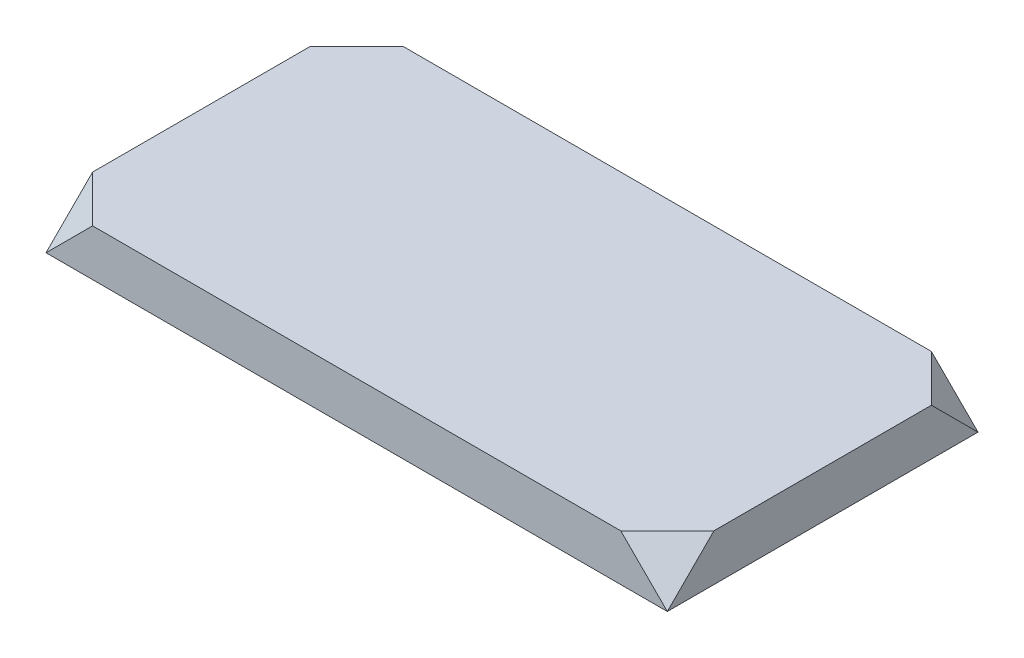
ISO-10303-21;
HEADER;
FILE_DESCRIPTION(('STEP AP214'),'2;1');
FILE_NAME('part.step','',(''),(''),'','','');
FILE_SCHEMA(('AUTOMOTIVE_DESIGN { 1 0 10303 214 1 1 1 1 }'));
ENDSEC;
DATA;
#1=APPLICATION_CONTEXT('core data for automotive mechanical design processes');
#2=APPLICATION_PROTOCOL_DEFINITION('international standard','automotive_design',2000,#1);
#3=PRODUCT_CONTEXT('',#1,'mechanical');
#4=PRODUCT('Part','Part','',(#3));
#5=PRODUCT_RELATED_PRODUCT_CATEGORY('part','',(#4));
#6=PRODUCT_DEFINITION_FORMATION('','',#4);
#7=PRODUCT_DEFINITION_CONTEXT('part definition',#1,'design');
#8=PRODUCT_DEFINITION('design','',#6,#7);
#9=PRODUCT_DEFINITION_SHAPE('','',#8);
#10=(LENGTH_UNIT() NAMED_UNIT(*) SI_UNIT(.MILLI.,.METRE.));
#11=(NAMED_UNIT(*) PLANE_ANGLE_UNIT() SI_UNIT($,.RADIAN.));
#12=(NAMED_UNIT(*) SI_UNIT($,.STERADIAN.) SOLID_ANGLE_UNIT());
#13=UNCERTAINTY_MEASURE_WITH_UNIT(LENGTH_MEASURE(1.E-05),#10,'distance_accuracy_value','');
#14=(GEOMETRIC_REPRESENTATION_CONTEXT(3) GLOBAL_UNCERTAINTY_ASSIGNED_CONTEXT((#13)) GLOBAL_UNIT_ASSIGNED_CONTEXT((#10,
#11,#12)) REPRESENTATION_CONTEXT('',''));
#15=CARTESIAN_POINT('',(0.,0.,0.));
#16=DIRECTION('',(0.,0.,1.));
#17=DIRECTION('',(1.,0.,0.));
#18=AXIS2_PLACEMENT_3D('',#15,#16,#17);
#19=CARTESIAN_POINT('',(20.,3.,10.));
#20=DIRECTION('',(-1.,0.,0.));
#21=DIRECTION('',(0.,0.,1.));
#22=AXIS2_PLACEMENT_3D('',#19,#20,#21);
#23=PLANE('',#22);
#24=DIRECTION('',(0.,0.707106781186548,-0.707106781186547));
#25=VECTOR('',#24,1.);
#26=CARTESIAN_POINT('',(20.,1.5,8.50000000000001));
#27=LINE('',#26,#25);
#28=CARTESIAN_POINT('',(20.,0.,10.));
#29=VERTEX_POINT('',#28);
#30=CARTESIAN_POINT('',(20.,3.,7.00000000000001));
#31=VERTEX_POINT('',#30);
#32=EDGE_CURVE('E111',#29,#31,#27,.T.);
#33=ORIENTED_EDGE('',*,*,#32,.F.);
#34=DIRECTION('',(0.,0.,-1.));
#35=VECTOR('',#34,1.);
#36=CARTESIAN_POINT('',(20.,0.,10.));
#37=LINE('',#36,#35);
#38=CARTESIAN_POINT('',(20.,0.,-10.));
#39=VERTEX_POINT('',#38);
#40=EDGE_CURVE('E159',#29,#39,#37,.T.);
#41=ORIENTED_EDGE('',*,*,#40,.T.);
#42=DIRECTION('',(0.,-0.707106781186548,-0.707106781186547));
#43=VECTOR('',#42,1.);
#44=CARTESIAN_POINT('',(20.,11.5,1.50000000000001));
#45=LINE('',#44,#43);
#46=CARTESIAN_POINT('',(20.,3.,-6.99999999999999));
#47=VERTEX_POINT('',#46);
#48=EDGE_CURVE('E124',#47,#39,#45,.T.);
#49=ORIENTED_EDGE('',*,*,#48,.F.);
#50=DIRECTION('',(0.,0.,-1.));
#51=VECTOR('',#50,1.);
#52=CARTESIAN_POINT('',(20.,3.,10.));
#53=LINE('',#52,#51);
#54=EDGE_CURVE('E150',#31,#47,#53,.T.);
#55=ORIENTED_EDGE('',*,*,#54,.F.);
#56=EDGE_LOOP('',(#33,#41,#49,#55));
#57=FACE_BOUND('',#56,.T.);
#58=ADVANCED_FACE('F43',(#57),#23,.F.);
#59=CARTESIAN_POINT('',(-20.,3.,-9.99999999999999));
#60=DIRECTION('',(0.,0.,1.));
#61=DIRECTION('',(1.,0.,0.));
#62=AXIS2_PLACEMENT_3D('',#59,#60,#61);
#63=PLANE('',#62);
#64=DIRECTION('',(-0.707106781186547,0.707106781186548,0.));
#65=VECTOR('',#64,1.);
#66=CARTESIAN_POINT('',(-1.49999999999996,21.5,-10.));
#67=LINE('',#66,#65);
#68=CARTESIAN_POINT('',(17.,3.,-10.));
#69=VERTEX_POINT('',#68);
#70=EDGE_CURVE('E118',#39,#69,#67,.T.);
#71=ORIENTED_EDGE('',*,*,#70,.F.);
#72=DIRECTION('',(-1.,0.,0.));
#73=VECTOR('',#72,1.);
#74=CARTESIAN_POINT('',(-20.,0.,-9.99999999999999));
#75=LINE('',#74,#73);
#76=CARTESIAN_POINT('',(-20.,0.,-9.99999999999999));
#77=VERTEX_POINT('',#76);
#78=EDGE_CURVE('E155',#39,#77,#75,.T.);
#79=ORIENTED_EDGE('',*,*,#78,.T.);
#80=DIRECTION('',(-0.707106781186547,-0.707106781186548,0.));
#81=VECTOR('',#80,1.);
#82=CARTESIAN_POINT('',(-18.5,1.5,-9.99999999999999));
#83=LINE('',#82,#81);
#84=CARTESIAN_POINT('',(-17.,3.,-10.));
#85=VERTEX_POINT('',#84);
#86=EDGE_CURVE('E136',#85,#77,#83,.T.);
#87=ORIENTED_EDGE('',*,*,#86,.F.);
#88=DIRECTION('',(-1.,0.,0.));
#89=VECTOR('',#88,1.);
#90=CARTESIAN_POINT('',(-20.,3.,-9.99999999999999));
#91=LINE('',#90,#89);
#92=EDGE_CURVE('E164',#69,#85,#91,.T.);
#93=ORIENTED_EDGE('',*,*,#92,.F.);
#94=EDGE_LOOP('',(#71,#79,#87,#93));
#95=FACE_BOUND('',#94,.T.);
#96=ADVANCED_FACE('F173',(#95),#63,.F.);
#97=CARTESIAN_POINT('',(-20.,3.,10.));
#98=DIRECTION('',(1.,0.,0.));
#99=DIRECTION('',(0.,0.,-1.));
#100=AXIS2_PLACEMENT_3D('',#97,#98,#99);
#101=PLANE('',#100);
#102=DIRECTION('',(0.,0.707106781186548,0.707106781186547));
#103=VECTOR('',#102,1.);
#104=CARTESIAN_POINT('',(-20.,11.5,1.5));
#105=LINE('',#104,#103);
#106=CARTESIAN_POINT('',(-20.,3.,-6.99999999999999));
#107=VERTEX_POINT('',#106);
#108=EDGE_CURVE('E132',#77,#107,#105,.T.);
#109=ORIENTED_EDGE('',*,*,#108,.F.);
#110=DIRECTION('',(0.,0.,1.));
#111=VECTOR('',#110,1.);
#112=CARTESIAN_POINT('',(-20.,0.,10.));
#113=LINE('',#112,#111);
#114=CARTESIAN_POINT('',(-20.,0.,10.));
#115=VERTEX_POINT('',#114);
#116=EDGE_CURVE('E151',#77,#115,#113,.T.);
#117=ORIENTED_EDGE('',*,*,#116,.T.);
#118=DIRECTION('',(0.,-0.707106781186548,0.707106781186547));
#119=VECTOR('',#118,1.);
#120=CARTESIAN_POINT('',(-20.,1.5,8.50000000000001));
#121=LINE('',#120,#119);
#122=CARTESIAN_POINT('',(-20.,3.,7.));
#123=VERTEX_POINT('',#122);
#124=EDGE_CURVE('E99',#123,#115,#121,.T.);
#125=ORIENTED_EDGE('',*,*,#124,.F.);
#126=DIRECTION('',(0.,0.,1.));
#127=VECTOR('',#126,1.);
#128=CARTESIAN_POINT('',(-20.,3.,10.));
#129=LINE('',#128,#127);
#130=EDGE_CURVE('E100',#107,#123,#129,.T.);
#131=ORIENTED_EDGE('',*,*,#130,.F.);
#132=EDGE_LOOP('',(#109,#117,#125,#131));
#133=FACE_BOUND('',#132,.T.);
#134=ADVANCED_FACE('F183',(#133),#101,.F.);
#135=CARTESIAN_POINT('',(-20.,3.,10.));
#136=DIRECTION('',(0.,0.,-1.));
#137=DIRECTION('',(-1.,0.,0.));
#138=AXIS2_PLACEMENT_3D('',#135,#136,#137);
#139=PLANE('',#138);
#140=DIRECTION('',(0.707106781186547,-0.707106781186548,0.));
#141=VECTOR('',#140,1.);
#142=CARTESIAN_POINT('',(-1.49999999999996,21.5,10.));
#143=LINE('',#142,#141);
#144=CARTESIAN_POINT('',(17.,3.,10.));
#145=VERTEX_POINT('',#144);
#146=EDGE_CURVE('E51',#145,#29,#143,.T.);
#147=ORIENTED_EDGE('',*,*,#146,.F.);
#148=DIRECTION('',(1.,0.,0.));
#149=VECTOR('',#148,1.);
#150=CARTESIAN_POINT('',(-20.,3.,10.));
#151=LINE('',#150,#149);
#152=CARTESIAN_POINT('',(-17.,3.,10.));
#153=VERTEX_POINT('',#152);
#154=EDGE_CURVE('E91',#153,#145,#151,.T.);
#155=ORIENTED_EDGE('',*,*,#154,.F.);
#156=DIRECTION('',(0.707106781186547,0.707106781186548,0.));
#157=VECTOR('',#156,1.);
#158=CARTESIAN_POINT('',(-18.5,1.5,10.));
#159=LINE('',#158,#157);
#160=EDGE_CURVE('E142',#115,#153,#159,.T.);
#161=ORIENTED_EDGE('',*,*,#160,.F.);
#162=DIRECTION('',(1.,0.,0.));
#163=VECTOR('',#162,1.);
#164=CARTESIAN_POINT('',(-20.,0.,10.));
#165=LINE('',#164,#163);
#166=EDGE_CURVE('E106',#115,#29,#165,.T.);
#167=ORIENTED_EDGE('',*,*,#166,.T.);
#168=EDGE_LOOP('',(#147,#155,#161,#167));
#169=FACE_BOUND('',#168,.T.);
#170=ADVANCED_FACE('F104',(#169),#139,.F.);
#171=CARTESIAN_POINT('',(0.,3.,0.));
#172=DIRECTION('',(0.,-1.,0.));
#173=DIRECTION('',(0.,0.,-1.));
#174=AXIS2_PLACEMENT_3D('',#171,#172,#173);
#175=PLANE('',#174);
#176=DIRECTION('',(-0.707106781186547,0.,0.707106781186548));
#177=VECTOR('',#176,1.);
#178=CARTESIAN_POINT('',(13.5,3.,13.5));
#179=LINE('',#178,#177);
#180=EDGE_CURVE('E11',#31,#145,#179,.T.);
#181=ORIENTED_EDGE('',*,*,#180,.F.);
#182=ORIENTED_EDGE('',*,*,#54,.T.);
#183=DIRECTION('',(0.707106781186547,0.,0.707106781186548));
#184=VECTOR('',#183,1.);
#185=CARTESIAN_POINT('',(13.5,3.,-13.5));
#186=LINE('',#185,#184);
#187=EDGE_CURVE('E62',#69,#47,#186,.T.);
#188=ORIENTED_EDGE('',*,*,#187,.F.);
#189=ORIENTED_EDGE('',*,*,#92,.T.);
#190=DIRECTION('',(0.707106781186547,0.,-0.707106781186548));
#191=VECTOR('',#190,1.);
#192=CARTESIAN_POINT('',(-13.5,3.,-13.5));
#193=LINE('',#192,#191);
#194=EDGE_CURVE('E128',#107,#85,#193,.T.);
#195=ORIENTED_EDGE('',*,*,#194,.F.);
#196=ORIENTED_EDGE('',*,*,#130,.T.);
#197=DIRECTION('',(-0.707106781186547,0.,-0.707106781186548));
#198=VECTOR('',#197,1.);
#199=CARTESIAN_POINT('',(-13.5,3.,13.5));
#200=LINE('',#199,#198);
#201=EDGE_CURVE('E95',#153,#123,#200,.T.);
#202=ORIENTED_EDGE('',*,*,#201,.F.);
#203=ORIENTED_EDGE('',*,*,#154,.T.);
#204=EDGE_LOOP('',(#181,#182,#188,#189,#195,#196,#202,#203));
#205=FACE_BOUND('',#204,.T.);
#206=ADVANCED_FACE('F93',(#205),#175,.F.);
#207=CARTESIAN_POINT('',(0.,0.,0.));
#208=DIRECTION('',(0.,-1.,0.));
#209=DIRECTION('',(0.,0.,-1.));
#210=AXIS2_PLACEMENT_3D('',#207,#208,#209);
#211=PLANE('',#210);
#212=ORIENTED_EDGE('',*,*,#40,.F.);
#213=ORIENTED_EDGE('',*,*,#166,.F.);
#214=ORIENTED_EDGE('',*,*,#116,.F.);
#215=ORIENTED_EDGE('',*,*,#78,.F.);
#216=EDGE_LOOP('',(#212,#213,#214,#215));
#217=FACE_BOUND('',#216,.T.);
#218=ADVANCED_FACE('F177',(#217),#211,.T.);
#219=CARTESIAN_POINT('',(-10.,9.99999999999999,9.99999999999999));
#220=DIRECTION('',(-0.577350269189626,0.577350269189626,0.577350269189626));
#221=DIRECTION('',(0.707106781186547,0.,0.707106781186548));
#222=AXIS2_PLACEMENT_3D('',#219,#220,#221);
#223=PLANE('',#222);
#224=ORIENTED_EDGE('',*,*,#201,.T.);
#225=ORIENTED_EDGE('',*,*,#124,.T.);
#226=ORIENTED_EDGE('',*,*,#160,.T.);
#227=EDGE_LOOP('',(#224,#225,#226));
#228=FACE_BOUND('',#227,.T.);
#229=ADVANCED_FACE('F185',(#228),#223,.T.);
#230=CARTESIAN_POINT('',(-9.99999999999999,9.99999999999999,-9.99999999999999));
#231=DIRECTION('',(-0.577350269189626,0.577350269189626,-0.577350269189626));
#232=DIRECTION('',(-0.707106781186547,0.,0.707106781186548));
#233=AXIS2_PLACEMENT_3D('',#230,#231,#232);
#234=PLANE('',#233);
#235=ORIENTED_EDGE('',*,*,#194,.T.);
#236=ORIENTED_EDGE('',*,*,#86,.T.);
#237=ORIENTED_EDGE('',*,*,#108,.T.);
#238=EDGE_LOOP('',(#235,#236,#237));
#239=FACE_BOUND('',#238,.T.);
#240=ADVANCED_FACE('F181',(#239),#234,.T.);
#241=CARTESIAN_POINT('',(10.,10.,-10.));
#242=DIRECTION('',(0.577350269189626,0.577350269189626,-0.577350269189626));
#243=DIRECTION('',(-0.707106781186547,0.,-0.707106781186548));
#244=AXIS2_PLACEMENT_3D('',#241,#242,#243);
#245=PLANE('',#244);
#246=ORIENTED_EDGE('',*,*,#187,.T.);
#247=ORIENTED_EDGE('',*,*,#48,.T.);
#248=ORIENTED_EDGE('',*,*,#70,.T.);
#249=EDGE_LOOP('',(#246,#247,#248));
#250=FACE_BOUND('',#249,.T.);
#251=ADVANCED_FACE('F170',(#250),#245,.T.);
#252=CARTESIAN_POINT('',(10.,10.,10.));
#253=DIRECTION('',(0.577350269189626,0.577350269189626,0.577350269189626));
#254=DIRECTION('',(0.707106781186547,0.,-0.707106781186548));
#255=AXIS2_PLACEMENT_3D('',#252,#253,#254);
#256=PLANE('',#255);
#257=ORIENTED_EDGE('',*,*,#146,.T.);
#258=ORIENTED_EDGE('',*,*,#32,.T.);
#259=ORIENTED_EDGE('',*,*,#180,.T.);
#260=EDGE_LOOP('',(#257,#258,#259));
#261=FACE_BOUND('',#260,.T.);
#262=ADVANCED_FACE('F112',(#261),#256,.T.);
#263=CLOSED_SHELL('',(#58,#96,#134,#170,#206,#218,#229,#240,#251,#262));
#264=MANIFOLD_SOLID_BREP('B2',#263);
#265=ADVANCED_BREP_SHAPE_REPRESENTATION('',(#18,#264),#14);
#266=SHAPE_DEFINITION_REPRESENTATION(#9,#265);
ENDSEC;
END-ISO-10303-21;
